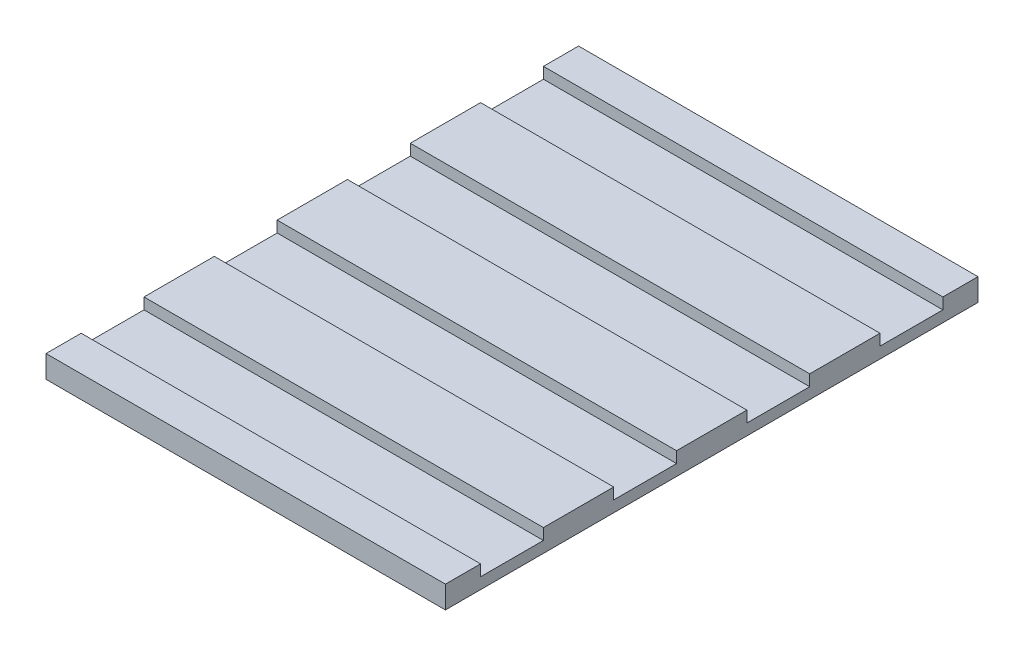
ISO-10303-21;
HEADER;
FILE_DESCRIPTION(('STEP AP214'),'2;1');
FILE_NAME('part.step','',(''),(''),'','','');
FILE_SCHEMA(('AUTOMOTIVE_DESIGN { 1 0 10303 214 1 1 1 1 }'));
ENDSEC;
DATA;
#1=APPLICATION_CONTEXT('core data for automotive mechanical design processes');
#2=APPLICATION_PROTOCOL_DEFINITION('international standard','automotive_design',2000,#1);
#3=PRODUCT_CONTEXT('',#1,'mechanical');
#4=PRODUCT('Part','Part','',(#3));
#5=PRODUCT_RELATED_PRODUCT_CATEGORY('part','',(#4));
#6=PRODUCT_DEFINITION_FORMATION('','',#4);
#7=PRODUCT_DEFINITION_CONTEXT('part definition',#1,'design');
#8=PRODUCT_DEFINITION('design','',#6,#7);
#9=PRODUCT_DEFINITION_SHAPE('','',#8);
#10=(LENGTH_UNIT() NAMED_UNIT(*) SI_UNIT(.MILLI.,.METRE.));
#11=(NAMED_UNIT(*) PLANE_ANGLE_UNIT() SI_UNIT($,.RADIAN.));
#12=(NAMED_UNIT(*) SI_UNIT($,.STERADIAN.) SOLID_ANGLE_UNIT());
#13=UNCERTAINTY_MEASURE_WITH_UNIT(LENGTH_MEASURE(1.E-05),#10,'distance_accuracy_value','');
#14=(GEOMETRIC_REPRESENTATION_CONTEXT(3) GLOBAL_UNCERTAINTY_ASSIGNED_CONTEXT((#13)) GLOBAL_UNIT_ASSIGNED_CONTEXT((#10,
#11,#12)) REPRESENTATION_CONTEXT('',''));
#15=CARTESIAN_POINT('',(0.,0.,0.));
#16=DIRECTION('',(0.,0.,1.));
#17=DIRECTION('',(1.,0.,0.));
#18=AXIS2_PLACEMENT_3D('',#15,#16,#17);
#19=CARTESIAN_POINT('',(0.,4.2,0.));
#20=DIRECTION('',(0.,1.,0.));
#21=DIRECTION('',(0.,0.,1.));
#22=AXIS2_PLACEMENT_3D('',#19,#20,#21);
#23=PLANE('',#22);
#24=DIRECTION('',(1.,0.,0.));
#25=VECTOR('',#24,1.);
#26=CARTESIAN_POINT('',(-10.8333333333333,4.2,-77.2712962962963));
#27=LINE('',#26,#25);
#28=CARTESIAN_POINT('',(-10.8333333333333,4.2,-77.2712962962963));
#29=VERTEX_POINT('',#28);
#30=CARTESIAN_POINT('',(64.1666666666667,4.2,-77.2712962962963));
#31=VERTEX_POINT('',#30);
#32=EDGE_CURVE('E194',#29,#31,#27,.T.);
#33=ORIENTED_EDGE('',*,*,#32,.F.);
#34=DIRECTION('',(0.,0.,1.));
#35=VECTOR('',#34,1.);
#36=CARTESIAN_POINT('',(-10.8333333333333,4.2,-95.6712962962963));
#37=LINE('',#36,#35);
#38=CARTESIAN_POINT('',(-10.8333333333333,4.2,-64.0712962962963));
#39=VERTEX_POINT('',#38);
#40=EDGE_CURVE('E319',#29,#39,#37,.T.);
#41=ORIENTED_EDGE('',*,*,#40,.T.);
#42=DIRECTION('',(-1.,0.,0.));
#43=VECTOR('',#42,1.);
#44=CARTESIAN_POINT('',(-10.8333333333333,4.2,-64.0712962962963));
#45=LINE('',#44,#43);
#46=CARTESIAN_POINT('',(64.1666666666666,4.2,-64.0712962962963));
#47=VERTEX_POINT('',#46);
#48=EDGE_CURVE('E225',#47,#39,#45,.T.);
#49=ORIENTED_EDGE('',*,*,#48,.F.);
#50=DIRECTION('',(0.,0.,-1.));
#51=VECTOR('',#50,1.);
#52=CARTESIAN_POINT('',(64.1666666666666,4.2,-95.6712962962963));
#53=LINE('',#52,#51);
#54=EDGE_CURVE('E374',#47,#31,#53,.T.);
#55=ORIENTED_EDGE('',*,*,#54,.T.);
#56=EDGE_LOOP('',(#33,#41,#49,#55));
#57=FACE_BOUND('',#56,.T.);
#58=ADVANCED_FACE('F39',(#57),#23,.T.);
#59=DIRECTION('',(1.,0.,0.));
#60=VECTOR('',#59,1.);
#61=CARTESIAN_POINT('',(-10.8333333333333,4.2,-52.2712962962963));
#62=LINE('',#61,#60);
#63=CARTESIAN_POINT('',(-10.8333333333333,4.2,-52.2712962962963));
#64=VERTEX_POINT('',#63);
#65=CARTESIAN_POINT('',(64.1666666666667,4.2,-52.2712962962963));
#66=VERTEX_POINT('',#65);
#67=EDGE_CURVE('E214',#64,#66,#62,.T.);
#68=ORIENTED_EDGE('',*,*,#67,.F.);
#69=CARTESIAN_POINT('',(-10.8333333333333,4.2,-39.0712962962963));
#70=VERTEX_POINT('',#69);
#71=EDGE_CURVE('E412',#64,#70,#37,.T.);
#72=ORIENTED_EDGE('',*,*,#71,.T.);
#73=DIRECTION('',(-1.,0.,0.));
#74=VECTOR('',#73,1.);
#75=CARTESIAN_POINT('',(-10.8333333333333,4.2,-39.0712962962963));
#76=LINE('',#75,#74);
#77=CARTESIAN_POINT('',(64.1666666666667,4.2,-39.0712962962963));
#78=VERTEX_POINT('',#77);
#79=EDGE_CURVE('E262',#78,#70,#76,.T.);
#80=ORIENTED_EDGE('',*,*,#79,.F.);
#81=EDGE_CURVE('E377',#78,#66,#53,.T.);
#82=ORIENTED_EDGE('',*,*,#81,.T.);
#83=EDGE_LOOP('',(#68,#72,#80,#82));
#84=FACE_BOUND('',#83,.T.);
#85=ADVANCED_FACE('F428',(#84),#23,.T.);
#86=DIRECTION('',(1.,0.,0.));
#87=VECTOR('',#86,1.);
#88=CARTESIAN_POINT('',(-10.8333333333333,4.2,-27.2712962962963));
#89=LINE('',#88,#87);
#90=CARTESIAN_POINT('',(-10.8333333333333,4.2,-27.2712962962963));
#91=VERTEX_POINT('',#90);
#92=CARTESIAN_POINT('',(64.1666666666667,4.2,-27.2712962962963));
#93=VERTEX_POINT('',#92);
#94=EDGE_CURVE('E250',#91,#93,#89,.T.);
#95=ORIENTED_EDGE('',*,*,#94,.F.);
#96=CARTESIAN_POINT('',(-10.8333333333333,4.2,-14.0712962962963));
#97=VERTEX_POINT('',#96);
#98=EDGE_CURVE('E409',#91,#97,#37,.T.);
#99=ORIENTED_EDGE('',*,*,#98,.T.);
#100=DIRECTION('',(-1.,0.,0.));
#101=VECTOR('',#100,1.);
#102=CARTESIAN_POINT('',(-10.8333333333333,4.2,-14.0712962962963));
#103=LINE('',#102,#101);
#104=CARTESIAN_POINT('',(64.1666666666667,4.2,-14.0712962962963));
#105=VERTEX_POINT('',#104);
#106=EDGE_CURVE('E297',#105,#97,#103,.T.);
#107=ORIENTED_EDGE('',*,*,#106,.F.);
#108=EDGE_CURVE('E328',#105,#93,#53,.T.);
#109=ORIENTED_EDGE('',*,*,#108,.T.);
#110=EDGE_LOOP('',(#95,#99,#107,#109));
#111=FACE_BOUND('',#110,.T.);
#112=ADVANCED_FACE('F393',(#111),#23,.T.);
#113=DIRECTION('',(1.,0.,0.));
#114=VECTOR('',#113,1.);
#115=CARTESIAN_POINT('',(-10.8333333333333,4.2,-2.2712962962963));
#116=LINE('',#115,#114);
#117=CARTESIAN_POINT('',(-10.8333333333333,4.2,-2.2712962962963));
#118=VERTEX_POINT('',#117);
#119=CARTESIAN_POINT('',(64.1666666666667,4.2,-2.2712962962963));
#120=VERTEX_POINT('',#119);
#121=EDGE_CURVE('E285',#118,#120,#116,.T.);
#122=ORIENTED_EDGE('',*,*,#121,.F.);
#123=CARTESIAN_POINT('',(-10.8333333333333,4.2,4.3287037037037));
#124=VERTEX_POINT('',#123);
#125=EDGE_CURVE('E320',#118,#124,#37,.T.);
#126=ORIENTED_EDGE('',*,*,#125,.T.);
#127=DIRECTION('',(1.,0.,0.));
#128=VECTOR('',#127,1.);
#129=CARTESIAN_POINT('',(-10.8333333333333,4.2,4.3287037037037));
#130=LINE('',#129,#128);
#131=CARTESIAN_POINT('',(64.1666666666667,4.2,4.3287037037037));
#132=VERTEX_POINT('',#131);
#133=EDGE_CURVE('E318',#124,#132,#130,.T.);
#134=ORIENTED_EDGE('',*,*,#133,.T.);
#135=EDGE_CURVE('E323',#132,#120,#53,.T.);
#136=ORIENTED_EDGE('',*,*,#135,.T.);
#137=EDGE_LOOP('',(#122,#126,#134,#136));
#138=FACE_BOUND('',#137,.T.);
#139=ADVANCED_FACE('F418',(#138),#23,.T.);
#140=CARTESIAN_POINT('',(-10.8333333333333,4.2,-95.6712962962963));
#141=DIRECTION('',(1.,0.,0.));
#142=DIRECTION('',(0.,0.,-1.));
#143=AXIS2_PLACEMENT_3D('',#140,#141,#142);
#144=PLANE('',#143);
#145=ORIENTED_EDGE('',*,*,#40,.F.);
#146=DIRECTION('',(0.,1.,0.));
#147=VECTOR('',#146,1.);
#148=CARTESIAN_POINT('',(-10.8333333333333,2.1,-77.2712962962963));
#149=LINE('',#148,#147);
#150=CARTESIAN_POINT('',(-10.8333333333333,2.1,-77.2712962962963));
#151=VERTEX_POINT('',#150);
#152=EDGE_CURVE('E204',#151,#29,#149,.T.);
#153=ORIENTED_EDGE('',*,*,#152,.F.);
#154=DIRECTION('',(0.,0.,1.));
#155=VECTOR('',#154,1.);
#156=CARTESIAN_POINT('',(-10.8333333333333,2.1,-89.0712962962963));
#157=LINE('',#156,#155);
#158=CARTESIAN_POINT('',(-10.8333333333333,2.1,-89.0712962962963));
#159=VERTEX_POINT('',#158);
#160=EDGE_CURVE('E183',#159,#151,#157,.T.);
#161=ORIENTED_EDGE('',*,*,#160,.F.);
#162=DIRECTION('',(0.,1.,0.));
#163=VECTOR('',#162,1.);
#164=CARTESIAN_POINT('',(-10.8333333333333,2.1,-89.0712962962963));
#165=LINE('',#164,#163);
#166=CARTESIAN_POINT('',(-10.8333333333333,4.2,-89.0712962962963));
#167=VERTEX_POINT('',#166);
#168=EDGE_CURVE('E179',#159,#167,#165,.T.);
#169=ORIENTED_EDGE('',*,*,#168,.T.);
#170=CARTESIAN_POINT('',(-10.8333333333333,4.2,-95.6712962962963));
#171=VERTEX_POINT('',#170);
#172=EDGE_CURVE('E314',#171,#167,#37,.T.);
#173=ORIENTED_EDGE('',*,*,#172,.F.);
#174=DIRECTION('',(0.,-1.,0.));
#175=VECTOR('',#174,1.);
#176=CARTESIAN_POINT('',(-10.8333333333333,4.2,-95.6712962962963));
#177=LINE('',#176,#175);
#178=CARTESIAN_POINT('',(-10.8333333333333,0.,-95.6712962962963));
#179=VERTEX_POINT('',#178);
#180=EDGE_CURVE('E331',#171,#179,#177,.T.);
#181=ORIENTED_EDGE('',*,*,#180,.T.);
#182=DIRECTION('',(0.,0.,1.));
#183=VECTOR('',#182,1.);
#184=CARTESIAN_POINT('',(-10.8333333333333,0.,-95.6712962962963));
#185=LINE('',#184,#183);
#186=CARTESIAN_POINT('',(-10.8333333333333,0.,4.3287037037037));
#187=VERTEX_POINT('',#186);
#188=EDGE_CURVE('E332',#179,#187,#185,.T.);
#189=ORIENTED_EDGE('',*,*,#188,.T.);
#190=DIRECTION('',(0.,-1.,0.));
#191=VECTOR('',#190,1.);
#192=CARTESIAN_POINT('',(-10.8333333333333,4.2,4.3287037037037));
#193=LINE('',#192,#191);
#194=EDGE_CURVE('E11',#124,#187,#193,.T.);
#195=ORIENTED_EDGE('',*,*,#194,.F.);
#196=ORIENTED_EDGE('',*,*,#125,.F.);
#197=DIRECTION('',(0.,1.,0.));
#198=VECTOR('',#197,1.);
#199=CARTESIAN_POINT('',(-10.8333333333333,2.1,-2.2712962962963));
#200=LINE('',#199,#198);
#201=CARTESIAN_POINT('',(-10.8333333333333,2.1,-2.2712962962963));
#202=VERTEX_POINT('',#201);
#203=EDGE_CURVE('E305',#202,#118,#200,.T.);
#204=ORIENTED_EDGE('',*,*,#203,.F.);
#205=DIRECTION('',(0.,0.,1.));
#206=VECTOR('',#205,1.);
#207=CARTESIAN_POINT('',(-10.8333333333333,2.1,-14.0712962962963));
#208=LINE('',#207,#206);
#209=CARTESIAN_POINT('',(-10.8333333333333,2.1,-14.0712962962963));
#210=VERTEX_POINT('',#209);
#211=EDGE_CURVE('E289',#210,#202,#208,.T.);
#212=ORIENTED_EDGE('',*,*,#211,.F.);
#213=DIRECTION('',(0.,1.,0.));
#214=VECTOR('',#213,1.);
#215=CARTESIAN_POINT('',(-10.8333333333333,2.1,-14.0712962962963));
#216=LINE('',#215,#214);
#217=EDGE_CURVE('E308',#210,#97,#216,.T.);
#218=ORIENTED_EDGE('',*,*,#217,.T.);
#219=ORIENTED_EDGE('',*,*,#98,.F.);
#220=DIRECTION('',(0.,1.,0.));
#221=VECTOR('',#220,1.);
#222=CARTESIAN_POINT('',(-10.8333333333333,2.1,-27.2712962962963));
#223=LINE('',#222,#221);
#224=CARTESIAN_POINT('',(-10.8333333333333,2.1,-27.2712962962963));
#225=VERTEX_POINT('',#224);
#226=EDGE_CURVE('E271',#225,#91,#223,.T.);
#227=ORIENTED_EDGE('',*,*,#226,.F.);
#228=DIRECTION('',(0.,0.,1.));
#229=VECTOR('',#228,1.);
#230=CARTESIAN_POINT('',(-10.8333333333333,2.1,-39.0712962962963));
#231=LINE('',#230,#229);
#232=CARTESIAN_POINT('',(-10.8333333333333,2.1,-39.0712962962963));
#233=VERTEX_POINT('',#232);
#234=EDGE_CURVE('E254',#233,#225,#231,.T.);
#235=ORIENTED_EDGE('',*,*,#234,.F.);
#236=DIRECTION('',(0.,1.,0.));
#237=VECTOR('',#236,1.);
#238=CARTESIAN_POINT('',(-10.8333333333333,2.1,-39.0712962962963));
#239=LINE('',#238,#237);
#240=EDGE_CURVE('E274',#233,#70,#239,.T.);
#241=ORIENTED_EDGE('',*,*,#240,.T.);
#242=ORIENTED_EDGE('',*,*,#71,.F.);
#243=DIRECTION('',(0.,1.,0.));
#244=VECTOR('',#243,1.);
#245=CARTESIAN_POINT('',(-10.8333333333333,2.1,-52.2712962962963));
#246=LINE('',#245,#244);
#247=CARTESIAN_POINT('',(-10.8333333333333,2.1,-52.2712962962963));
#248=VERTEX_POINT('',#247);
#249=EDGE_CURVE('E236',#248,#64,#246,.T.);
#250=ORIENTED_EDGE('',*,*,#249,.F.);
#251=DIRECTION('',(0.,0.,1.));
#252=VECTOR('',#251,1.);
#253=CARTESIAN_POINT('',(-10.8333333333333,2.1,-64.0712962962963));
#254=LINE('',#253,#252);
#255=CARTESIAN_POINT('',(-10.8333333333333,2.1,-64.0712962962963));
#256=VERTEX_POINT('',#255);
#257=EDGE_CURVE('E218',#256,#248,#254,.T.);
#258=ORIENTED_EDGE('',*,*,#257,.F.);
#259=DIRECTION('',(0.,1.,0.));
#260=VECTOR('',#259,1.);
#261=CARTESIAN_POINT('',(-10.8333333333333,2.1,-64.0712962962963));
#262=LINE('',#261,#260);
#263=EDGE_CURVE('E239',#256,#39,#262,.T.);
#264=ORIENTED_EDGE('',*,*,#263,.T.);
#265=EDGE_LOOP('',(#145,#153,#161,#169,#173,#181,#189,#195,#196,#204,#212,#218,#219,#227,#235,
#241,#242,#250,#258,#264));
#266=FACE_BOUND('',#265,.T.);
#267=ADVANCED_FACE('F41',(#266),#144,.F.);
#268=CARTESIAN_POINT('',(-10.8333333333333,4.2,4.3287037037037));
#269=DIRECTION('',(0.,0.,-1.));
#270=DIRECTION('',(-1.,0.,0.));
#271=AXIS2_PLACEMENT_3D('',#268,#269,#270);
#272=PLANE('',#271);
#273=DIRECTION('',(1.,0.,0.));
#274=VECTOR('',#273,1.);
#275=CARTESIAN_POINT('',(-10.8333333333333,0.,4.3287037037037));
#276=LINE('',#275,#274);
#277=CARTESIAN_POINT('',(64.1666666666667,0.,4.3287037037037));
#278=VERTEX_POINT('',#277);
#279=EDGE_CURVE('E336',#187,#278,#276,.T.);
#280=ORIENTED_EDGE('',*,*,#279,.T.);
#281=DIRECTION('',(0.,-1.,0.));
#282=VECTOR('',#281,1.);
#283=CARTESIAN_POINT('',(64.1666666666667,4.2,4.3287037037037));
#284=LINE('',#283,#282);
#285=EDGE_CURVE('E48',#132,#278,#284,.T.);
#286=ORIENTED_EDGE('',*,*,#285,.F.);
#287=ORIENTED_EDGE('',*,*,#133,.F.);
#288=ORIENTED_EDGE('',*,*,#194,.T.);
#289=EDGE_LOOP('',(#280,#286,#287,#288));
#290=FACE_BOUND('',#289,.T.);
#291=ADVANCED_FACE('F420',(#290),#272,.F.);
#292=CARTESIAN_POINT('',(64.1666666666666,4.2,-95.6712962962963));
#293=DIRECTION('',(-1.,0.,0.));
#294=DIRECTION('',(0.,0.,1.));
#295=AXIS2_PLACEMENT_3D('',#292,#293,#294);
#296=PLANE('',#295);
#297=DIRECTION('',(0.,0.,-1.));
#298=VECTOR('',#297,1.);
#299=CARTESIAN_POINT('',(64.1666666666667,2.1,-89.0712962962963));
#300=LINE('',#299,#298);
#301=CARTESIAN_POINT('',(64.1666666666667,2.1,-77.2712962962963));
#302=VERTEX_POINT('',#301);
#303=CARTESIAN_POINT('',(64.1666666666667,2.1,-89.0712962962963));
#304=VERTEX_POINT('',#303);
#305=EDGE_CURVE('E184',#302,#304,#300,.T.);
#306=ORIENTED_EDGE('',*,*,#305,.F.);
#307=DIRECTION('',(0.,1.,0.));
#308=VECTOR('',#307,1.);
#309=CARTESIAN_POINT('',(64.1666666666667,2.1,-77.2712962962963));
#310=LINE('',#309,#308);
#311=EDGE_CURVE('E337',#302,#31,#310,.T.);
#312=ORIENTED_EDGE('',*,*,#311,.T.);
#313=ORIENTED_EDGE('',*,*,#54,.F.);
#314=DIRECTION('',(0.,1.,0.));
#315=VECTOR('',#314,1.);
#316=CARTESIAN_POINT('',(64.1666666666667,2.1,-64.0712962962963));
#317=LINE('',#316,#315);
#318=CARTESIAN_POINT('',(64.1666666666667,2.1,-64.0712962962963));
#319=VERTEX_POINT('',#318);
#320=EDGE_CURVE('E63',#319,#47,#317,.T.);
#321=ORIENTED_EDGE('',*,*,#320,.F.);
#322=DIRECTION('',(0.,0.,-1.));
#323=VECTOR('',#322,1.);
#324=CARTESIAN_POINT('',(64.1666666666667,2.1,-64.0712962962963));
#325=LINE('',#324,#323);
#326=CARTESIAN_POINT('',(64.1666666666667,2.1,-52.2712962962963));
#327=VERTEX_POINT('',#326);
#328=EDGE_CURVE('E209',#327,#319,#325,.T.);
#329=ORIENTED_EDGE('',*,*,#328,.F.);
#330=DIRECTION('',(0.,1.,0.));
#331=VECTOR('',#330,1.);
#332=CARTESIAN_POINT('',(64.1666666666667,2.1,-52.2712962962963));
#333=LINE('',#332,#331);
#334=EDGE_CURVE('E231',#327,#66,#333,.T.);
#335=ORIENTED_EDGE('',*,*,#334,.T.);
#336=ORIENTED_EDGE('',*,*,#81,.F.);
#337=DIRECTION('',(0.,1.,0.));
#338=VECTOR('',#337,1.);
#339=CARTESIAN_POINT('',(64.1666666666667,2.1,-39.0712962962963));
#340=LINE('',#339,#338);
#341=CARTESIAN_POINT('',(64.1666666666667,2.1,-39.0712962962963));
#342=VERTEX_POINT('',#341);
#343=EDGE_CURVE('E261',#342,#78,#340,.T.);
#344=ORIENTED_EDGE('',*,*,#343,.F.);
#345=DIRECTION('',(0.,0.,-1.));
#346=VECTOR('',#345,1.);
#347=CARTESIAN_POINT('',(64.1666666666667,2.1,-39.0712962962963));
#348=LINE('',#347,#346);
#349=CARTESIAN_POINT('',(64.1666666666667,2.1,-27.2712962962963));
#350=VERTEX_POINT('',#349);
#351=EDGE_CURVE('E245',#350,#342,#348,.T.);
#352=ORIENTED_EDGE('',*,*,#351,.F.);
#353=DIRECTION('',(0.,1.,0.));
#354=VECTOR('',#353,1.);
#355=CARTESIAN_POINT('',(64.1666666666667,2.1,-27.2712962962963));
#356=LINE('',#355,#354);
#357=EDGE_CURVE('E228',#350,#93,#356,.T.);
#358=ORIENTED_EDGE('',*,*,#357,.T.);
#359=ORIENTED_EDGE('',*,*,#108,.F.);
#360=DIRECTION('',(0.,1.,0.));
#361=VECTOR('',#360,1.);
#362=CARTESIAN_POINT('',(64.1666666666667,2.1,-14.0712962962963));
#363=LINE('',#362,#361);
#364=CARTESIAN_POINT('',(64.1666666666667,2.1,-14.0712962962963));
#365=VERTEX_POINT('',#364);
#366=EDGE_CURVE('E296',#365,#105,#363,.T.);
#367=ORIENTED_EDGE('',*,*,#366,.F.);
#368=DIRECTION('',(0.,0.,-1.));
#369=VECTOR('',#368,1.);
#370=CARTESIAN_POINT('',(64.1666666666667,2.1,-14.0712962962963));
#371=LINE('',#370,#369);
#372=CARTESIAN_POINT('',(64.1666666666667,2.1,-2.2712962962963));
#373=VERTEX_POINT('',#372);
#374=EDGE_CURVE('E280',#373,#365,#371,.T.);
#375=ORIENTED_EDGE('',*,*,#374,.F.);
#376=DIRECTION('',(0.,1.,0.));
#377=VECTOR('',#376,1.);
#378=CARTESIAN_POINT('',(64.1666666666667,2.1,-2.2712962962963));
#379=LINE('',#378,#377);
#380=EDGE_CURVE('E265',#373,#120,#379,.T.);
#381=ORIENTED_EDGE('',*,*,#380,.T.);
#382=ORIENTED_EDGE('',*,*,#135,.F.);
#383=ORIENTED_EDGE('',*,*,#285,.T.);
#384=DIRECTION('',(0.,0.,-1.));
#385=VECTOR('',#384,1.);
#386=CARTESIAN_POINT('',(64.1666666666666,0.,-95.6712962962963));
#387=LINE('',#386,#385);
#388=CARTESIAN_POINT('',(64.1666666666666,0.,-95.6712962962963));
#389=VERTEX_POINT('',#388);
#390=EDGE_CURVE('E340',#278,#389,#387,.T.);
#391=ORIENTED_EDGE('',*,*,#390,.T.);
#392=DIRECTION('',(0.,-1.,0.));
#393=VECTOR('',#392,1.);
#394=CARTESIAN_POINT('',(64.1666666666666,4.2,-95.6712962962963));
#395=LINE('',#394,#393);
#396=CARTESIAN_POINT('',(64.1666666666666,4.2,-95.6712962962963));
#397=VERTEX_POINT('',#396);
#398=EDGE_CURVE('E349',#397,#389,#395,.T.);
#399=ORIENTED_EDGE('',*,*,#398,.F.);
#400=CARTESIAN_POINT('',(64.1666666666666,4.2,-89.0712962962963));
#401=VERTEX_POINT('',#400);
#402=EDGE_CURVE('E199',#401,#397,#53,.T.);
#403=ORIENTED_EDGE('',*,*,#402,.F.);
#404=DIRECTION('',(0.,1.,0.));
#405=VECTOR('',#404,1.);
#406=CARTESIAN_POINT('',(64.1666666666667,2.1,-89.0712962962963));
#407=LINE('',#406,#405);
#408=EDGE_CURVE('E55',#304,#401,#407,.T.);
#409=ORIENTED_EDGE('',*,*,#408,.F.);
#410=EDGE_LOOP('',(#306,#312,#313,#321,#329,#335,#336,#344,#352,#358,#359,#367,#375,#381,#382,
#383,#391,#399,#403,#409));
#411=FACE_BOUND('',#410,.T.);
#412=ADVANCED_FACE('F197',(#411),#296,.F.);
#413=CARTESIAN_POINT('',(-10.8333333333333,4.2,-95.6712962962963));
#414=DIRECTION('',(0.,0.,1.));
#415=DIRECTION('',(1.,0.,0.));
#416=AXIS2_PLACEMENT_3D('',#413,#414,#415);
#417=PLANE('',#416);
#418=DIRECTION('',(-1.,0.,0.));
#419=VECTOR('',#418,1.);
#420=CARTESIAN_POINT('',(-10.8333333333333,0.,-95.6712962962963));
#421=LINE('',#420,#419);
#422=EDGE_CURVE('E343',#389,#179,#421,.T.);
#423=ORIENTED_EDGE('',*,*,#422,.T.);
#424=ORIENTED_EDGE('',*,*,#180,.F.);
#425=DIRECTION('',(-1.,0.,0.));
#426=VECTOR('',#425,1.);
#427=CARTESIAN_POINT('',(-10.8333333333333,4.2,-95.6712962962963));
#428=LINE('',#427,#426);
#429=EDGE_CURVE('E327',#397,#171,#428,.T.);
#430=ORIENTED_EDGE('',*,*,#429,.F.);
#431=ORIENTED_EDGE('',*,*,#398,.T.);
#432=EDGE_LOOP('',(#423,#424,#430,#431));
#433=FACE_BOUND('',#432,.T.);
#434=ADVANCED_FACE('F365',(#433),#417,.F.);
#435=DIRECTION('',(-1.,0.,0.));
#436=VECTOR('',#435,1.);
#437=CARTESIAN_POINT('',(-10.8333333333333,4.2,-89.0712962962963));
#438=LINE('',#437,#436);
#439=EDGE_CURVE('E235',#401,#167,#438,.T.);
#440=ORIENTED_EDGE('',*,*,#439,.F.);
#441=ORIENTED_EDGE('',*,*,#402,.T.);
#442=ORIENTED_EDGE('',*,*,#429,.T.);
#443=ORIENTED_EDGE('',*,*,#172,.T.);
#444=EDGE_LOOP('',(#440,#441,#442,#443));
#445=FACE_BOUND('',#444,.T.);
#446=ADVANCED_FACE('F372',(#445),#23,.T.);
#447=CARTESIAN_POINT('',(0.,0.,0.));
#448=DIRECTION('',(0.,1.,0.));
#449=DIRECTION('',(0.,0.,1.));
#450=AXIS2_PLACEMENT_3D('',#447,#448,#449);
#451=PLANE('',#450);
#452=ORIENTED_EDGE('',*,*,#188,.F.);
#453=ORIENTED_EDGE('',*,*,#422,.F.);
#454=ORIENTED_EDGE('',*,*,#390,.F.);
#455=ORIENTED_EDGE('',*,*,#279,.F.);
#456=EDGE_LOOP('',(#452,#453,#454,#455));
#457=FACE_BOUND('',#456,.T.);
#458=ADVANCED_FACE('F362',(#457),#451,.F.);
#459=CARTESIAN_POINT('',(-10.8333333333333,2.1,-2.2712962962963));
#460=DIRECTION('',(0.,0.,1.));
#461=DIRECTION('',(1.,0.,0.));
#462=AXIS2_PLACEMENT_3D('',#459,#460,#461);
#463=PLANE('',#462);
#464=ORIENTED_EDGE('',*,*,#121,.T.);
#465=ORIENTED_EDGE('',*,*,#380,.F.);
#466=DIRECTION('',(1.,0.,0.));
#467=VECTOR('',#466,1.);
#468=CARTESIAN_POINT('',(-10.8333333333333,2.1,-2.2712962962963));
#469=LINE('',#468,#467);
#470=EDGE_CURVE('E292',#202,#373,#469,.T.);
#471=ORIENTED_EDGE('',*,*,#470,.F.);
#472=ORIENTED_EDGE('',*,*,#203,.T.);
#473=EDGE_LOOP('',(#464,#465,#471,#472));
#474=FACE_BOUND('',#473,.T.);
#475=ADVANCED_FACE('F440',(#474),#463,.F.);
#476=CARTESIAN_POINT('',(-10.8333333333333,2.1,-14.0712962962963));
#477=DIRECTION('',(0.,0.,-1.));
#478=DIRECTION('',(-1.,0.,0.));
#479=AXIS2_PLACEMENT_3D('',#476,#477,#478);
#480=PLANE('',#479);
#481=ORIENTED_EDGE('',*,*,#106,.T.);
#482=ORIENTED_EDGE('',*,*,#217,.F.);
#483=DIRECTION('',(-1.,0.,0.));
#484=VECTOR('',#483,1.);
#485=CARTESIAN_POINT('',(-10.8333333333333,2.1,-14.0712962962963));
#486=LINE('',#485,#484);
#487=EDGE_CURVE('E284',#365,#210,#486,.T.);
#488=ORIENTED_EDGE('',*,*,#487,.F.);
#489=ORIENTED_EDGE('',*,*,#366,.T.);
#490=EDGE_LOOP('',(#481,#482,#488,#489));
#491=FACE_BOUND('',#490,.T.);
#492=ADVANCED_FACE('F497',(#491),#480,.F.);
#493=CARTESIAN_POINT('',(0.,2.1,0.));
#494=DIRECTION('',(0.,1.,0.));
#495=DIRECTION('',(0.,0.,1.));
#496=AXIS2_PLACEMENT_3D('',#493,#494,#495);
#497=PLANE('',#496);
#498=ORIENTED_EDGE('',*,*,#374,.T.);
#499=ORIENTED_EDGE('',*,*,#487,.T.);
#500=ORIENTED_EDGE('',*,*,#211,.T.);
#501=ORIENTED_EDGE('',*,*,#470,.T.);
#502=EDGE_LOOP('',(#498,#499,#500,#501));
#503=FACE_BOUND('',#502,.T.);
#504=ADVANCED_FACE('F507',(#503),#497,.T.);
#505=CARTESIAN_POINT('',(-10.8333333333333,2.1,-27.2712962962963));
#506=DIRECTION('',(0.,0.,1.));
#507=DIRECTION('',(1.,0.,0.));
#508=AXIS2_PLACEMENT_3D('',#505,#506,#507);
#509=PLANE('',#508);
#510=ORIENTED_EDGE('',*,*,#94,.T.);
#511=ORIENTED_EDGE('',*,*,#357,.F.);
#512=DIRECTION('',(1.,0.,0.));
#513=VECTOR('',#512,1.);
#514=CARTESIAN_POINT('',(-10.8333333333333,2.1,-27.2712962962963));
#515=LINE('',#514,#513);
#516=EDGE_CURVE('E257',#225,#350,#515,.T.);
#517=ORIENTED_EDGE('',*,*,#516,.F.);
#518=ORIENTED_EDGE('',*,*,#226,.T.);
#519=EDGE_LOOP('',(#510,#511,#517,#518));
#520=FACE_BOUND('',#519,.T.);
#521=ADVANCED_FACE('F402',(#520),#509,.F.);
#522=CARTESIAN_POINT('',(-10.8333333333333,2.1,-39.0712962962963));
#523=DIRECTION('',(0.,0.,-1.));
#524=DIRECTION('',(-1.,0.,0.));
#525=AXIS2_PLACEMENT_3D('',#522,#523,#524);
#526=PLANE('',#525);
#527=ORIENTED_EDGE('',*,*,#79,.T.);
#528=ORIENTED_EDGE('',*,*,#240,.F.);
#529=DIRECTION('',(-1.,0.,0.));
#530=VECTOR('',#529,1.);
#531=CARTESIAN_POINT('',(-10.8333333333333,2.1,-39.0712962962963));
#532=LINE('',#531,#530);
#533=EDGE_CURVE('E249',#342,#233,#532,.T.);
#534=ORIENTED_EDGE('',*,*,#533,.F.);
#535=ORIENTED_EDGE('',*,*,#343,.T.);
#536=EDGE_LOOP('',(#527,#528,#534,#535));
#537=FACE_BOUND('',#536,.T.);
#538=ADVANCED_FACE('F526',(#537),#526,.F.);
#539=CARTESIAN_POINT('',(0.,2.1,0.));
#540=DIRECTION('',(0.,1.,0.));
#541=DIRECTION('',(0.,0.,1.));
#542=AXIS2_PLACEMENT_3D('',#539,#540,#541);
#543=PLANE('',#542);
#544=ORIENTED_EDGE('',*,*,#351,.T.);
#545=ORIENTED_EDGE('',*,*,#533,.T.);
#546=ORIENTED_EDGE('',*,*,#234,.T.);
#547=ORIENTED_EDGE('',*,*,#516,.T.);
#548=EDGE_LOOP('',(#544,#545,#546,#547));
#549=FACE_BOUND('',#548,.T.);
#550=ADVANCED_FACE('F405',(#549),#543,.T.);
#551=CARTESIAN_POINT('',(-10.8333333333333,2.1,-52.2712962962963));
#552=DIRECTION('',(0.,0.,1.));
#553=DIRECTION('',(1.,0.,0.));
#554=AXIS2_PLACEMENT_3D('',#551,#552,#553);
#555=PLANE('',#554);
#556=ORIENTED_EDGE('',*,*,#67,.T.);
#557=ORIENTED_EDGE('',*,*,#334,.F.);
#558=DIRECTION('',(1.,0.,0.));
#559=VECTOR('',#558,1.);
#560=CARTESIAN_POINT('',(-10.8333333333333,2.1,-52.2712962962963));
#561=LINE('',#560,#559);
#562=EDGE_CURVE('E221',#248,#327,#561,.T.);
#563=ORIENTED_EDGE('',*,*,#562,.F.);
#564=ORIENTED_EDGE('',*,*,#249,.T.);
#565=EDGE_LOOP('',(#556,#557,#563,#564));
#566=FACE_BOUND('',#565,.T.);
#567=ADVANCED_FACE('F544',(#566),#555,.F.);
#568=CARTESIAN_POINT('',(-10.8333333333333,2.1,-64.0712962962963));
#569=DIRECTION('',(0.,0.,-1.));
#570=DIRECTION('',(-1.,0.,0.));
#571=AXIS2_PLACEMENT_3D('',#568,#569,#570);
#572=PLANE('',#571);
#573=ORIENTED_EDGE('',*,*,#48,.T.);
#574=ORIENTED_EDGE('',*,*,#263,.F.);
#575=DIRECTION('',(-1.,0.,0.));
#576=VECTOR('',#575,1.);
#577=CARTESIAN_POINT('',(-10.8333333333333,2.1,-64.0712962962963));
#578=LINE('',#577,#576);
#579=EDGE_CURVE('E213',#319,#256,#578,.T.);
#580=ORIENTED_EDGE('',*,*,#579,.F.);
#581=ORIENTED_EDGE('',*,*,#320,.T.);
#582=EDGE_LOOP('',(#573,#574,#580,#581));
#583=FACE_BOUND('',#582,.T.);
#584=ADVANCED_FACE('F553',(#583),#572,.F.);
#585=CARTESIAN_POINT('',(0.,2.1,0.));
#586=DIRECTION('',(0.,1.,0.));
#587=DIRECTION('',(0.,0.,1.));
#588=AXIS2_PLACEMENT_3D('',#585,#586,#587);
#589=PLANE('',#588);
#590=ORIENTED_EDGE('',*,*,#328,.T.);
#591=ORIENTED_EDGE('',*,*,#579,.T.);
#592=ORIENTED_EDGE('',*,*,#257,.T.);
#593=ORIENTED_EDGE('',*,*,#562,.T.);
#594=EDGE_LOOP('',(#590,#591,#592,#593));
#595=FACE_BOUND('',#594,.T.);
#596=ADVANCED_FACE('F563',(#595),#589,.T.);
#597=CARTESIAN_POINT('',(-10.8333333333333,2.1,-77.2712962962963));
#598=DIRECTION('',(0.,0.,1.));
#599=DIRECTION('',(1.,0.,0.));
#600=AXIS2_PLACEMENT_3D('',#597,#598,#599);
#601=PLANE('',#600);
#602=ORIENTED_EDGE('',*,*,#32,.T.);
#603=ORIENTED_EDGE('',*,*,#311,.F.);
#604=DIRECTION('',(1.,0.,0.));
#605=VECTOR('',#604,1.);
#606=CARTESIAN_POINT('',(-10.8333333333333,2.1,-77.2712962962963));
#607=LINE('',#606,#605);
#608=EDGE_CURVE('E190',#151,#302,#607,.T.);
#609=ORIENTED_EDGE('',*,*,#608,.F.);
#610=ORIENTED_EDGE('',*,*,#152,.T.);
#611=EDGE_LOOP('',(#602,#603,#609,#610));
#612=FACE_BOUND('',#611,.T.);
#613=ADVANCED_FACE('F573',(#612),#601,.F.);
#614=CARTESIAN_POINT('',(-10.8333333333333,2.1,-89.0712962962963));
#615=DIRECTION('',(0.,0.,-1.));
#616=DIRECTION('',(-1.,0.,0.));
#617=AXIS2_PLACEMENT_3D('',#614,#615,#616);
#618=PLANE('',#617);
#619=ORIENTED_EDGE('',*,*,#439,.T.);
#620=ORIENTED_EDGE('',*,*,#168,.F.);
#621=DIRECTION('',(-1.,0.,0.));
#622=VECTOR('',#621,1.);
#623=CARTESIAN_POINT('',(-10.8333333333333,2.1,-89.0712962962963));
#624=LINE('',#623,#622);
#625=EDGE_CURVE('E175',#304,#159,#624,.T.);
#626=ORIENTED_EDGE('',*,*,#625,.F.);
#627=ORIENTED_EDGE('',*,*,#408,.T.);
#628=EDGE_LOOP('',(#619,#620,#626,#627));
#629=FACE_BOUND('',#628,.T.);
#630=ADVANCED_FACE('F177',(#629),#618,.F.);
#631=CARTESIAN_POINT('',(0.,2.1,0.));
#632=DIRECTION('',(0.,1.,0.));
#633=DIRECTION('',(0.,0.,1.));
#634=AXIS2_PLACEMENT_3D('',#631,#632,#633);
#635=PLANE('',#634);
#636=ORIENTED_EDGE('',*,*,#305,.T.);
#637=ORIENTED_EDGE('',*,*,#625,.T.);
#638=ORIENTED_EDGE('',*,*,#160,.T.);
#639=ORIENTED_EDGE('',*,*,#608,.T.);
#640=EDGE_LOOP('',(#636,#637,#638,#639));
#641=FACE_BOUND('',#640,.T.);
#642=ADVANCED_FACE('F188',(#641),#635,.T.);
#643=CLOSED_SHELL('',(#58,#85,#112,#139,#267,#291,#412,#434,#446,#458,#475,#492,#504,#521,#538,
#550,#567,#584,#596,#613,#630,#642));
#644=MANIFOLD_SOLID_BREP('B2',#643);
#645=ADVANCED_BREP_SHAPE_REPRESENTATION('',(#18,#644),#14);
#646=SHAPE_DEFINITION_REPRESENTATION(#9,#645);
ENDSEC;
END-ISO-10303-21;
